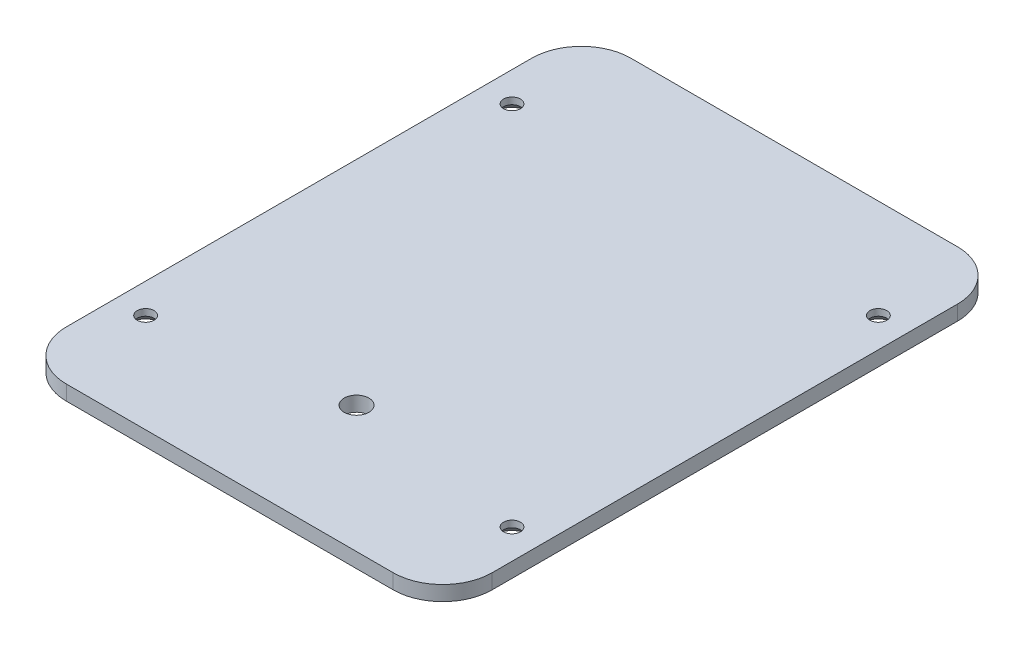
ISO-10303-21;
HEADER;
FILE_DESCRIPTION(('STEP AP214'),'2;1');
FILE_NAME('part.step','',(''),(''),'','','');
FILE_SCHEMA(('AUTOMOTIVE_DESIGN { 1 0 10303 214 1 1 1 1 }'));
ENDSEC;
DATA;
#1=APPLICATION_CONTEXT('core data for automotive mechanical design processes');
#2=APPLICATION_PROTOCOL_DEFINITION('international standard','automotive_design',2000,#1);
#3=PRODUCT_CONTEXT('',#1,'mechanical');
#4=PRODUCT('Part','Part','',(#3));
#5=PRODUCT_RELATED_PRODUCT_CATEGORY('part','',(#4));
#6=PRODUCT_DEFINITION_FORMATION('','',#4);
#7=PRODUCT_DEFINITION_CONTEXT('part definition',#1,'design');
#8=PRODUCT_DEFINITION('design','',#6,#7);
#9=PRODUCT_DEFINITION_SHAPE('','',#8);
#10=(LENGTH_UNIT() NAMED_UNIT(*) SI_UNIT(.MILLI.,.METRE.));
#11=(NAMED_UNIT(*) PLANE_ANGLE_UNIT() SI_UNIT($,.RADIAN.));
#12=(NAMED_UNIT(*) SI_UNIT($,.STERADIAN.) SOLID_ANGLE_UNIT());
#13=UNCERTAINTY_MEASURE_WITH_UNIT(LENGTH_MEASURE(1.E-05),#10,'distance_accuracy_value','');
#14=(GEOMETRIC_REPRESENTATION_CONTEXT(3) GLOBAL_UNCERTAINTY_ASSIGNED_CONTEXT((#13)) GLOBAL_UNIT_ASSIGNED_CONTEXT((#10,
#11,#12)) REPRESENTATION_CONTEXT('',''));
#15=CARTESIAN_POINT('',(0.,0.,0.));
#16=DIRECTION('',(0.,0.,1.));
#17=DIRECTION('',(1.,0.,0.));
#18=AXIS2_PLACEMENT_3D('',#15,#16,#17);
#19=CARTESIAN_POINT('',(-33.,3.,47.));
#20=DIRECTION('',(0.,-1.,0.));
#21=DIRECTION('',(0.,0.,-1.));
#22=AXIS2_PLACEMENT_3D('',#19,#20,#21);
#23=CYLINDRICAL_SURFACE('',#22,10.);
#24=CARTESIAN_POINT('',(-33.,0.,47.));
#25=DIRECTION('',(0.,1.,0.));
#26=DIRECTION('',(0.,0.,1.));
#27=AXIS2_PLACEMENT_3D('',#24,#25,#26);
#28=CIRCLE('',#27,10.);
#29=CARTESIAN_POINT('',(-43.,0.,47.));
#30=VERTEX_POINT('',#29);
#31=CARTESIAN_POINT('',(-33.,0.,57.));
#32=VERTEX_POINT('',#31);
#33=EDGE_CURVE('E131',#30,#32,#28,.T.);
#34=ORIENTED_EDGE('',*,*,#33,.T.);
#35=DIRECTION('',(0.,-1.,0.));
#36=VECTOR('',#35,1.);
#37=CARTESIAN_POINT('',(-33.,3.,57.));
#38=LINE('',#37,#36);
#39=CARTESIAN_POINT('',(-33.,3.,57.));
#40=VERTEX_POINT('',#39);
#41=EDGE_CURVE('E11',#40,#32,#38,.T.);
#42=ORIENTED_EDGE('',*,*,#41,.F.);
#43=CARTESIAN_POINT('',(-33.,3.,47.));
#44=DIRECTION('',(0.,1.,0.));
#45=DIRECTION('',(0.,0.,1.));
#46=AXIS2_PLACEMENT_3D('',#43,#44,#45);
#47=CIRCLE('',#46,10.);
#48=CARTESIAN_POINT('',(-43.,3.,47.));
#49=VERTEX_POINT('',#48);
#50=EDGE_CURVE('E146',#49,#40,#47,.T.);
#51=ORIENTED_EDGE('',*,*,#50,.F.);
#52=DIRECTION('',(0.,-1.,0.));
#53=VECTOR('',#52,1.);
#54=CARTESIAN_POINT('',(-43.,3.,47.));
#55=LINE('',#54,#53);
#56=EDGE_CURVE('E127',#49,#30,#55,.T.);
#57=ORIENTED_EDGE('',*,*,#56,.T.);
#58=EDGE_LOOP('',(#34,#42,#51,#57));
#59=FACE_BOUND('',#58,.T.);
#60=ADVANCED_FACE('F33',(#59),#23,.T.);
#61=CARTESIAN_POINT('',(33.,3.,57.));
#62=DIRECTION('',(0.,0.,-1.));
#63=DIRECTION('',(-1.,0.,0.));
#64=AXIS2_PLACEMENT_3D('',#61,#62,#63);
#65=PLANE('',#64);
#66=DIRECTION('',(1.,0.,0.));
#67=VECTOR('',#66,1.);
#68=CARTESIAN_POINT('',(33.,0.,57.));
#69=LINE('',#68,#67);
#70=CARTESIAN_POINT('',(33.,0.,57.));
#71=VERTEX_POINT('',#70);
#72=EDGE_CURVE('E134',#32,#71,#69,.T.);
#73=ORIENTED_EDGE('',*,*,#72,.T.);
#74=DIRECTION('',(0.,-1.,0.));
#75=VECTOR('',#74,1.);
#76=CARTESIAN_POINT('',(33.,3.,57.));
#77=LINE('',#76,#75);
#78=CARTESIAN_POINT('',(33.,3.,57.));
#79=VERTEX_POINT('',#78);
#80=EDGE_CURVE('E42',#79,#71,#77,.T.);
#81=ORIENTED_EDGE('',*,*,#80,.F.);
#82=DIRECTION('',(1.,0.,0.));
#83=VECTOR('',#82,1.);
#84=CARTESIAN_POINT('',(33.,3.,57.));
#85=LINE('',#84,#83);
#86=EDGE_CURVE('E94',#40,#79,#85,.T.);
#87=ORIENTED_EDGE('',*,*,#86,.F.);
#88=ORIENTED_EDGE('',*,*,#41,.T.);
#89=EDGE_LOOP('',(#73,#81,#87,#88));
#90=FACE_BOUND('',#89,.T.);
#91=ADVANCED_FACE('F228',(#90),#65,.F.);
#92=CARTESIAN_POINT('',(33.,3.,47.));
#93=DIRECTION('',(0.,-1.,0.));
#94=DIRECTION('',(0.,0.,-1.));
#95=AXIS2_PLACEMENT_3D('',#92,#93,#94);
#96=CYLINDRICAL_SURFACE('',#95,10.);
#97=CARTESIAN_POINT('',(33.,0.,47.));
#98=DIRECTION('',(0.,1.,0.));
#99=DIRECTION('',(0.,0.,1.));
#100=AXIS2_PLACEMENT_3D('',#97,#98,#99);
#101=CIRCLE('',#100,10.);
#102=CARTESIAN_POINT('',(43.,0.,47.));
#103=VERTEX_POINT('',#102);
#104=EDGE_CURVE('E137',#71,#103,#101,.T.);
#105=ORIENTED_EDGE('',*,*,#104,.T.);
#106=DIRECTION('',(0.,-1.,0.));
#107=VECTOR('',#106,1.);
#108=CARTESIAN_POINT('',(43.,3.,47.));
#109=LINE('',#108,#107);
#110=CARTESIAN_POINT('',(43.,3.,47.));
#111=VERTEX_POINT('',#110);
#112=EDGE_CURVE('E153',#111,#103,#109,.T.);
#113=ORIENTED_EDGE('',*,*,#112,.F.);
#114=CARTESIAN_POINT('',(33.,3.,47.));
#115=DIRECTION('',(0.,1.,0.));
#116=DIRECTION('',(0.,0.,1.));
#117=AXIS2_PLACEMENT_3D('',#114,#115,#116);
#118=CIRCLE('',#117,10.);
#119=EDGE_CURVE('E196',#79,#111,#118,.T.);
#120=ORIENTED_EDGE('',*,*,#119,.F.);
#121=ORIENTED_EDGE('',*,*,#80,.T.);
#122=EDGE_LOOP('',(#105,#113,#120,#121));
#123=FACE_BOUND('',#122,.T.);
#124=ADVANCED_FACE('F232',(#123),#96,.T.);
#125=CARTESIAN_POINT('',(43.,3.,-47.));
#126=DIRECTION('',(-1.,0.,0.));
#127=DIRECTION('',(0.,0.,1.));
#128=AXIS2_PLACEMENT_3D('',#125,#126,#127);
#129=PLANE('',#128);
#130=DIRECTION('',(0.,0.,-1.));
#131=VECTOR('',#130,1.);
#132=CARTESIAN_POINT('',(43.,0.,-47.));
#133=LINE('',#132,#131);
#134=CARTESIAN_POINT('',(43.,0.,-47.));
#135=VERTEX_POINT('',#134);
#136=EDGE_CURVE('E139',#103,#135,#133,.T.);
#137=ORIENTED_EDGE('',*,*,#136,.T.);
#138=DIRECTION('',(0.,-1.,0.));
#139=VECTOR('',#138,1.);
#140=CARTESIAN_POINT('',(43.,3.,-47.));
#141=LINE('',#140,#139);
#142=CARTESIAN_POINT('',(43.,3.,-47.));
#143=VERTEX_POINT('',#142);
#144=EDGE_CURVE('E150',#143,#135,#141,.T.);
#145=ORIENTED_EDGE('',*,*,#144,.F.);
#146=DIRECTION('',(0.,0.,-1.));
#147=VECTOR('',#146,1.);
#148=CARTESIAN_POINT('',(43.,3.,-47.));
#149=LINE('',#148,#147);
#150=EDGE_CURVE('E198',#111,#143,#149,.T.);
#151=ORIENTED_EDGE('',*,*,#150,.F.);
#152=ORIENTED_EDGE('',*,*,#112,.T.);
#153=EDGE_LOOP('',(#137,#145,#151,#152));
#154=FACE_BOUND('',#153,.T.);
#155=ADVANCED_FACE('F204',(#154),#129,.F.);
#156=CARTESIAN_POINT('',(33.,3.,-47.));
#157=DIRECTION('',(0.,-1.,0.));
#158=DIRECTION('',(0.,0.,-1.));
#159=AXIS2_PLACEMENT_3D('',#156,#157,#158);
#160=CYLINDRICAL_SURFACE('',#159,10.);
#161=CARTESIAN_POINT('',(33.,0.,-47.));
#162=DIRECTION('',(0.,1.,0.));
#163=DIRECTION('',(0.,0.,1.));
#164=AXIS2_PLACEMENT_3D('',#161,#162,#163);
#165=CIRCLE('',#164,10.);
#166=CARTESIAN_POINT('',(33.,0.,-57.));
#167=VERTEX_POINT('',#166);
#168=EDGE_CURVE('E141',#135,#167,#165,.T.);
#169=ORIENTED_EDGE('',*,*,#168,.T.);
#170=DIRECTION('',(0.,-1.,0.));
#171=VECTOR('',#170,1.);
#172=CARTESIAN_POINT('',(33.,3.,-57.));
#173=LINE('',#172,#171);
#174=CARTESIAN_POINT('',(33.,3.,-57.));
#175=VERTEX_POINT('',#174);
#176=EDGE_CURVE('E122',#175,#167,#173,.T.);
#177=ORIENTED_EDGE('',*,*,#176,.F.);
#178=CARTESIAN_POINT('',(33.,3.,-47.));
#179=DIRECTION('',(0.,1.,0.));
#180=DIRECTION('',(0.,0.,1.));
#181=AXIS2_PLACEMENT_3D('',#178,#179,#180);
#182=CIRCLE('',#181,10.);
#183=EDGE_CURVE('E113',#143,#175,#182,.T.);
#184=ORIENTED_EDGE('',*,*,#183,.F.);
#185=ORIENTED_EDGE('',*,*,#144,.T.);
#186=EDGE_LOOP('',(#169,#177,#184,#185));
#187=FACE_BOUND('',#186,.T.);
#188=ADVANCED_FACE('F208',(#187),#160,.T.);
#189=CARTESIAN_POINT('',(-33.,3.,-57.));
#190=DIRECTION('',(0.,0.,1.));
#191=DIRECTION('',(1.,0.,0.));
#192=AXIS2_PLACEMENT_3D('',#189,#190,#191);
#193=PLANE('',#192);
#194=DIRECTION('',(-1.,0.,0.));
#195=VECTOR('',#194,1.);
#196=CARTESIAN_POINT('',(-33.,0.,-57.));
#197=LINE('',#196,#195);
#198=CARTESIAN_POINT('',(-33.,0.,-57.));
#199=VERTEX_POINT('',#198);
#200=EDGE_CURVE('E121',#167,#199,#197,.T.);
#201=ORIENTED_EDGE('',*,*,#200,.T.);
#202=DIRECTION('',(0.,-1.,0.));
#203=VECTOR('',#202,1.);
#204=CARTESIAN_POINT('',(-33.,3.,-57.));
#205=LINE('',#204,#203);
#206=CARTESIAN_POINT('',(-33.,3.,-57.));
#207=VERTEX_POINT('',#206);
#208=EDGE_CURVE('E118',#207,#199,#205,.T.);
#209=ORIENTED_EDGE('',*,*,#208,.F.);
#210=DIRECTION('',(-1.,0.,0.));
#211=VECTOR('',#210,1.);
#212=CARTESIAN_POINT('',(-33.,3.,-57.));
#213=LINE('',#212,#211);
#214=EDGE_CURVE('E107',#175,#207,#213,.T.);
#215=ORIENTED_EDGE('',*,*,#214,.F.);
#216=ORIENTED_EDGE('',*,*,#176,.T.);
#217=EDGE_LOOP('',(#201,#209,#215,#216));
#218=FACE_BOUND('',#217,.T.);
#219=ADVANCED_FACE('F119',(#218),#193,.F.);
#220=CARTESIAN_POINT('',(-33.,3.,-47.));
#221=DIRECTION('',(0.,-1.,0.));
#222=DIRECTION('',(0.,0.,-1.));
#223=AXIS2_PLACEMENT_3D('',#220,#221,#222);
#224=CYLINDRICAL_SURFACE('',#223,10.);
#225=CARTESIAN_POINT('',(-33.,0.,-47.));
#226=DIRECTION('',(0.,1.,0.));
#227=DIRECTION('',(0.,0.,1.));
#228=AXIS2_PLACEMENT_3D('',#225,#226,#227);
#229=CIRCLE('',#228,10.);
#230=CARTESIAN_POINT('',(-43.,0.,-47.));
#231=VERTEX_POINT('',#230);
#232=EDGE_CURVE('E80',#199,#231,#229,.T.);
#233=ORIENTED_EDGE('',*,*,#232,.T.);
#234=DIRECTION('',(0.,-1.,0.));
#235=VECTOR('',#234,1.);
#236=CARTESIAN_POINT('',(-43.,3.,-47.));
#237=LINE('',#236,#235);
#238=CARTESIAN_POINT('',(-43.,3.,-47.));
#239=VERTEX_POINT('',#238);
#240=EDGE_CURVE('E123',#239,#231,#237,.T.);
#241=ORIENTED_EDGE('',*,*,#240,.F.);
#242=CARTESIAN_POINT('',(-33.,3.,-47.));
#243=DIRECTION('',(0.,1.,0.));
#244=DIRECTION('',(0.,0.,1.));
#245=AXIS2_PLACEMENT_3D('',#242,#243,#244);
#246=CIRCLE('',#245,10.);
#247=EDGE_CURVE('E111',#207,#239,#246,.T.);
#248=ORIENTED_EDGE('',*,*,#247,.F.);
#249=ORIENTED_EDGE('',*,*,#208,.T.);
#250=EDGE_LOOP('',(#233,#241,#248,#249));
#251=FACE_BOUND('',#250,.T.);
#252=ADVANCED_FACE('F125',(#251),#224,.T.);
#253=CARTESIAN_POINT('',(-43.,3.,47.));
#254=DIRECTION('',(1.,0.,0.));
#255=DIRECTION('',(0.,0.,-1.));
#256=AXIS2_PLACEMENT_3D('',#253,#254,#255);
#257=PLANE('',#256);
#258=DIRECTION('',(0.,0.,1.));
#259=VECTOR('',#258,1.);
#260=CARTESIAN_POINT('',(-43.,0.,47.));
#261=LINE('',#260,#259);
#262=EDGE_CURVE('E86',#231,#30,#261,.T.);
#263=ORIENTED_EDGE('',*,*,#262,.T.);
#264=ORIENTED_EDGE('',*,*,#56,.F.);
#265=DIRECTION('',(0.,0.,1.));
#266=VECTOR('',#265,1.);
#267=CARTESIAN_POINT('',(-43.,3.,47.));
#268=LINE('',#267,#266);
#269=EDGE_CURVE('E51',#239,#49,#268,.T.);
#270=ORIENTED_EDGE('',*,*,#269,.F.);
#271=ORIENTED_EDGE('',*,*,#240,.T.);
#272=EDGE_LOOP('',(#263,#264,#270,#271));
#273=FACE_BOUND('',#272,.T.);
#274=ADVANCED_FACE('F216',(#273),#257,.F.);
#275=CARTESIAN_POINT('',(-33.,3.,47.));
#276=DIRECTION('',(0.,1.,0.));
#277=DIRECTION('',(0.,0.,1.));
#278=AXIS2_PLACEMENT_3D('',#275,#276,#277);
#279=PLANE('',#278);
#280=CARTESIAN_POINT('',(-37.,3.,-37.));
#281=DIRECTION('',(0.,1.,0.));
#282=DIRECTION('',(0.,0.,1.));
#283=AXIS2_PLACEMENT_3D('',#280,#281,#282);
#284=CIRCLE('',#283,1.69999999999999);
#285=CARTESIAN_POINT('',(-37.,3.,-35.3));
#286=VERTEX_POINT('',#285);
#287=EDGE_CURVE('E36',#286,#286,#284,.T.);
#288=ORIENTED_EDGE('',*,*,#287,.F.);
#289=EDGE_LOOP('',(#288));
#290=FACE_BOUND('',#289,.T.);
#291=CARTESIAN_POINT('',(-37.,3.,37.));
#292=DIRECTION('',(0.,1.,0.));
#293=DIRECTION('',(0.,0.,1.));
#294=AXIS2_PLACEMENT_3D('',#291,#292,#293);
#295=CIRCLE('',#294,1.69999999999999);
#296=CARTESIAN_POINT('',(-37.,3.,38.7));
#297=VERTEX_POINT('',#296);
#298=EDGE_CURVE('E167',#297,#297,#295,.T.);
#299=ORIENTED_EDGE('',*,*,#298,.F.);
#300=EDGE_LOOP('',(#299));
#301=FACE_BOUND('',#300,.T.);
#302=CARTESIAN_POINT('',(37.,3.,-37.));
#303=DIRECTION('',(0.,1.,0.));
#304=DIRECTION('',(0.,0.,1.));
#305=AXIS2_PLACEMENT_3D('',#302,#303,#304);
#306=CIRCLE('',#305,1.69999999999999);
#307=CARTESIAN_POINT('',(37.,3.,-35.3));
#308=VERTEX_POINT('',#307);
#309=EDGE_CURVE('E163',#308,#308,#306,.T.);
#310=ORIENTED_EDGE('',*,*,#309,.F.);
#311=EDGE_LOOP('',(#310));
#312=FACE_BOUND('',#311,.T.);
#313=CARTESIAN_POINT('',(37.,3.,37.));
#314=DIRECTION('',(0.,1.,0.));
#315=DIRECTION('',(0.,0.,1.));
#316=AXIS2_PLACEMENT_3D('',#313,#314,#315);
#317=CIRCLE('',#316,1.69999999999999);
#318=CARTESIAN_POINT('',(37.,3.,38.7));
#319=VERTEX_POINT('',#318);
#320=EDGE_CURVE('E158',#319,#319,#317,.T.);
#321=ORIENTED_EDGE('',*,*,#320,.F.);
#322=EDGE_LOOP('',(#321));
#323=FACE_BOUND('',#322,.T.);
#324=CARTESIAN_POINT('',(0.,3.,31.4));
#325=DIRECTION('',(0.,-1.,0.));
#326=DIRECTION('',(0.,0.,-1.));
#327=AXIS2_PLACEMENT_3D('',#324,#325,#326);
#328=CIRCLE('',#327,2.5);
#329=CARTESIAN_POINT('',(0.,3.,28.9));
#330=VERTEX_POINT('',#329);
#331=EDGE_CURVE('E135',#330,#330,#328,.T.);
#332=ORIENTED_EDGE('',*,*,#331,.T.);
#333=EDGE_LOOP('',(#332));
#334=FACE_BOUND('',#333,.T.);
#335=ORIENTED_EDGE('',*,*,#50,.T.);
#336=ORIENTED_EDGE('',*,*,#86,.T.);
#337=ORIENTED_EDGE('',*,*,#119,.T.);
#338=ORIENTED_EDGE('',*,*,#150,.T.);
#339=ORIENTED_EDGE('',*,*,#183,.T.);
#340=ORIENTED_EDGE('',*,*,#214,.T.);
#341=ORIENTED_EDGE('',*,*,#247,.T.);
#342=ORIENTED_EDGE('',*,*,#269,.T.);
#343=EDGE_LOOP('',(#335,#336,#337,#338,#339,#340,#341,#342));
#344=FACE_BOUND('',#343,.T.);
#345=ADVANCED_FACE('F109',(#290,#301,#312,#323,#334,#344),#279,.T.);
#346=CARTESIAN_POINT('',(-33.,0.,47.));
#347=DIRECTION('',(0.,1.,0.));
#348=DIRECTION('',(0.,0.,1.));
#349=AXIS2_PLACEMENT_3D('',#346,#347,#348);
#350=PLANE('',#349);
#351=CARTESIAN_POINT('',(-37.,0.,-37.));
#352=DIRECTION('',(0.,-1.,0.));
#353=DIRECTION('',(0.,0.,-1.));
#354=AXIS2_PLACEMENT_3D('',#351,#352,#353);
#355=CIRCLE('',#354,3.36);
#356=CARTESIAN_POINT('',(-37.,0.,-40.36));
#357=VERTEX_POINT('',#356);
#358=EDGE_CURVE('E369',#357,#357,#355,.T.);
#359=ORIENTED_EDGE('',*,*,#358,.F.);
#360=EDGE_LOOP('',(#359));
#361=FACE_BOUND('',#360,.T.);
#362=CARTESIAN_POINT('',(-37.,0.,37.));
#363=DIRECTION('',(0.,-1.,0.));
#364=DIRECTION('',(0.,0.,-1.));
#365=AXIS2_PLACEMENT_3D('',#362,#363,#364);
#366=CIRCLE('',#365,3.36);
#367=CARTESIAN_POINT('',(-37.,0.,33.64));
#368=VERTEX_POINT('',#367);
#369=EDGE_CURVE('E176',#368,#368,#366,.T.);
#370=ORIENTED_EDGE('',*,*,#369,.F.);
#371=EDGE_LOOP('',(#370));
#372=FACE_BOUND('',#371,.T.);
#373=CARTESIAN_POINT('',(37.,0.,-37.));
#374=DIRECTION('',(0.,-1.,0.));
#375=DIRECTION('',(0.,0.,-1.));
#376=AXIS2_PLACEMENT_3D('',#373,#374,#375);
#377=CIRCLE('',#376,3.36);
#378=CARTESIAN_POINT('',(37.,0.,-40.36));
#379=VERTEX_POINT('',#378);
#380=EDGE_CURVE('E169',#379,#379,#377,.T.);
#381=ORIENTED_EDGE('',*,*,#380,.F.);
#382=EDGE_LOOP('',(#381));
#383=FACE_BOUND('',#382,.T.);
#384=CARTESIAN_POINT('',(37.,0.,37.));
#385=DIRECTION('',(0.,-1.,0.));
#386=DIRECTION('',(0.,0.,-1.));
#387=AXIS2_PLACEMENT_3D('',#384,#385,#386);
#388=CIRCLE('',#387,3.36);
#389=CARTESIAN_POINT('',(37.,0.,33.64));
#390=VERTEX_POINT('',#389);
#391=EDGE_CURVE('E165',#390,#390,#388,.T.);
#392=ORIENTED_EDGE('',*,*,#391,.F.);
#393=EDGE_LOOP('',(#392));
#394=FACE_BOUND('',#393,.T.);
#395=CARTESIAN_POINT('',(0.,0.,31.4));
#396=DIRECTION('',(0.,-1.,0.));
#397=DIRECTION('',(0.,0.,-1.));
#398=AXIS2_PLACEMENT_3D('',#395,#396,#397);
#399=CIRCLE('',#398,2.5);
#400=CARTESIAN_POINT('',(0.,0.,28.9));
#401=VERTEX_POINT('',#400);
#402=EDGE_CURVE('E161',#401,#401,#399,.T.);
#403=ORIENTED_EDGE('',*,*,#402,.F.);
#404=EDGE_LOOP('',(#403));
#405=FACE_BOUND('',#404,.T.);
#406=ORIENTED_EDGE('',*,*,#33,.F.);
#407=ORIENTED_EDGE('',*,*,#262,.F.);
#408=ORIENTED_EDGE('',*,*,#232,.F.);
#409=ORIENTED_EDGE('',*,*,#200,.F.);
#410=ORIENTED_EDGE('',*,*,#168,.F.);
#411=ORIENTED_EDGE('',*,*,#136,.F.);
#412=ORIENTED_EDGE('',*,*,#104,.F.);
#413=ORIENTED_EDGE('',*,*,#72,.F.);
#414=EDGE_LOOP('',(#406,#407,#408,#409,#410,#411,#412,#413));
#415=FACE_BOUND('',#414,.T.);
#416=ADVANCED_FACE('F211',(#361,#372,#383,#394,#405,#415),#350,.F.);
#417=CARTESIAN_POINT('',(0.,3.,31.4));
#418=DIRECTION('',(0.,-1.,0.));
#419=DIRECTION('',(0.,0.,-1.));
#420=AXIS2_PLACEMENT_3D('',#417,#418,#419);
#421=CYLINDRICAL_SURFACE('',#420,2.5);
#422=ORIENTED_EDGE('',*,*,#331,.F.);
#423=EDGE_LOOP('',(#422));
#424=FACE_BOUND('',#423,.T.);
#425=ORIENTED_EDGE('',*,*,#402,.T.);
#426=EDGE_LOOP('',(#425));
#427=FACE_BOUND('',#426,.T.);
#428=ADVANCED_FACE('F262',(#424,#427),#421,.F.);
#429=CARTESIAN_POINT('',(37.,0.,37.));
#430=DIRECTION('',(0.,-1.,0.));
#431=DIRECTION('',(0.,0.,-1.));
#432=AXIS2_PLACEMENT_3D('',#429,#430,#431);
#433=CYLINDRICAL_SURFACE('',#432,1.69999999999999);
#434=ORIENTED_EDGE('',*,*,#320,.T.);
#435=EDGE_LOOP('',(#434));
#436=FACE_BOUND('',#435,.T.);
#437=CARTESIAN_POINT('',(37.,1.66000000000001,37.));
#438=DIRECTION('',(0.,-1.,0.));
#439=DIRECTION('',(0.,0.,-1.));
#440=AXIS2_PLACEMENT_3D('',#437,#438,#439);
#441=CIRCLE('',#440,1.69999999999999);
#442=CARTESIAN_POINT('',(37.,1.66000000000001,35.3));
#443=VERTEX_POINT('',#442);
#444=EDGE_CURVE('E162',#443,#443,#441,.T.);
#445=ORIENTED_EDGE('',*,*,#444,.T.);
#446=EDGE_LOOP('',(#445));
#447=FACE_BOUND('',#446,.T.);
#448=ADVANCED_FACE('F267',(#436,#447),#433,.F.);
#449=CARTESIAN_POINT('',(37.,0.,37.));
#450=DIRECTION('',(0.,-1.,0.));
#451=DIRECTION('',(0.,0.,-1.));
#452=AXIS2_PLACEMENT_3D('',#449,#450,#451);
#453=CONICAL_SURFACE('',#452,3.36,0.785398163397448);
#454=ORIENTED_EDGE('',*,*,#444,.F.);
#455=EDGE_LOOP('',(#454));
#456=FACE_BOUND('',#455,.T.);
#457=ORIENTED_EDGE('',*,*,#391,.T.);
#458=EDGE_LOOP('',(#457));
#459=FACE_BOUND('',#458,.T.);
#460=ADVANCED_FACE('F290',(#456,#459),#453,.F.);
#461=CARTESIAN_POINT('',(37.,0.,-37.));
#462=DIRECTION('',(0.,-1.,0.));
#463=DIRECTION('',(0.,0.,-1.));
#464=AXIS2_PLACEMENT_3D('',#461,#462,#463);
#465=CYLINDRICAL_SURFACE('',#464,1.69999999999999);
#466=ORIENTED_EDGE('',*,*,#309,.T.);
#467=EDGE_LOOP('',(#466));
#468=FACE_BOUND('',#467,.T.);
#469=CARTESIAN_POINT('',(37.,1.66000000000001,-37.));
#470=DIRECTION('',(0.,-1.,0.));
#471=DIRECTION('',(0.,0.,-1.));
#472=AXIS2_PLACEMENT_3D('',#469,#470,#471);
#473=CIRCLE('',#472,1.69999999999999);
#474=CARTESIAN_POINT('',(37.,1.66000000000001,-38.7));
#475=VERTEX_POINT('',#474);
#476=EDGE_CURVE('E166',#475,#475,#473,.T.);
#477=ORIENTED_EDGE('',*,*,#476,.T.);
#478=EDGE_LOOP('',(#477));
#479=FACE_BOUND('',#478,.T.);
#480=ADVANCED_FACE('F300',(#468,#479),#465,.F.);
#481=CARTESIAN_POINT('',(37.,0.,-37.));
#482=DIRECTION('',(0.,-1.,0.));
#483=DIRECTION('',(0.,0.,-1.));
#484=AXIS2_PLACEMENT_3D('',#481,#482,#483);
#485=CONICAL_SURFACE('',#484,3.36,0.785398163397448);
#486=ORIENTED_EDGE('',*,*,#476,.F.);
#487=EDGE_LOOP('',(#486));
#488=FACE_BOUND('',#487,.T.);
#489=ORIENTED_EDGE('',*,*,#380,.T.);
#490=EDGE_LOOP('',(#489));
#491=FACE_BOUND('',#490,.T.);
#492=ADVANCED_FACE('F310',(#488,#491),#485,.F.);
#493=CARTESIAN_POINT('',(-37.,0.,37.));
#494=DIRECTION('',(0.,-1.,0.));
#495=DIRECTION('',(0.,0.,-1.));
#496=AXIS2_PLACEMENT_3D('',#493,#494,#495);
#497=CYLINDRICAL_SURFACE('',#496,1.69999999999999);
#498=ORIENTED_EDGE('',*,*,#298,.T.);
#499=EDGE_LOOP('',(#498));
#500=FACE_BOUND('',#499,.T.);
#501=CARTESIAN_POINT('',(-37.,1.66000000000001,37.));
#502=DIRECTION('',(0.,-1.,0.));
#503=DIRECTION('',(0.,0.,-1.));
#504=AXIS2_PLACEMENT_3D('',#501,#502,#503);
#505=CIRCLE('',#504,1.69999999999999);
#506=CARTESIAN_POINT('',(-37.,1.66000000000001,35.3));
#507=VERTEX_POINT('',#506);
#508=EDGE_CURVE('E170',#507,#507,#505,.T.);
#509=ORIENTED_EDGE('',*,*,#508,.T.);
#510=EDGE_LOOP('',(#509));
#511=FACE_BOUND('',#510,.T.);
#512=ADVANCED_FACE('F320',(#500,#511),#497,.F.);
#513=CARTESIAN_POINT('',(-37.,0.,37.));
#514=DIRECTION('',(0.,-1.,0.));
#515=DIRECTION('',(0.,0.,-1.));
#516=AXIS2_PLACEMENT_3D('',#513,#514,#515);
#517=CONICAL_SURFACE('',#516,3.36,0.785398163397448);
#518=ORIENTED_EDGE('',*,*,#508,.F.);
#519=EDGE_LOOP('',(#518));
#520=FACE_BOUND('',#519,.T.);
#521=ORIENTED_EDGE('',*,*,#369,.T.);
#522=EDGE_LOOP('',(#521));
#523=FACE_BOUND('',#522,.T.);
#524=ADVANCED_FACE('F330',(#520,#523),#517,.F.);
#525=CARTESIAN_POINT('',(-37.,0.,-37.));
#526=DIRECTION('',(0.,-1.,0.));
#527=DIRECTION('',(0.,0.,-1.));
#528=AXIS2_PLACEMENT_3D('',#525,#526,#527);
#529=CYLINDRICAL_SURFACE('',#528,1.69999999999999);
#530=ORIENTED_EDGE('',*,*,#287,.T.);
#531=EDGE_LOOP('',(#530));
#532=FACE_BOUND('',#531,.T.);
#533=CARTESIAN_POINT('',(-37.,1.66000000000001,-37.));
#534=DIRECTION('',(0.,-1.,0.));
#535=DIRECTION('',(0.,0.,-1.));
#536=AXIS2_PLACEMENT_3D('',#533,#534,#535);
#537=CIRCLE('',#536,1.69999999999999);
#538=CARTESIAN_POINT('',(-37.,1.66000000000001,-38.7));
#539=VERTEX_POINT('',#538);
#540=EDGE_CURVE('E366',#539,#539,#537,.T.);
#541=ORIENTED_EDGE('',*,*,#540,.T.);
#542=EDGE_LOOP('',(#541));
#543=FACE_BOUND('',#542,.T.);
#544=ADVANCED_FACE('F339',(#532,#543),#529,.F.);
#545=CARTESIAN_POINT('',(-37.,0.,-37.));
#546=DIRECTION('',(0.,-1.,0.));
#547=DIRECTION('',(0.,0.,-1.));
#548=AXIS2_PLACEMENT_3D('',#545,#546,#547);
#549=CONICAL_SURFACE('',#548,3.36,0.785398163397448);
#550=ORIENTED_EDGE('',*,*,#540,.F.);
#551=EDGE_LOOP('',(#550));
#552=FACE_BOUND('',#551,.T.);
#553=ORIENTED_EDGE('',*,*,#358,.T.);
#554=EDGE_LOOP('',(#553));
#555=FACE_BOUND('',#554,.T.);
#556=ADVANCED_FACE('F349',(#552,#555),#549,.F.);
#557=CLOSED_SHELL('',(#60,#91,#124,#155,#188,#219,#252,#274,#345,#416,#428,#448,#460,#480,#492,
#512,#524,#544,#556));
#558=MANIFOLD_SOLID_BREP('B2',#557);
#559=ADVANCED_BREP_SHAPE_REPRESENTATION('',(#18,#558),#14);
#560=SHAPE_DEFINITION_REPRESENTATION(#9,#559);
ENDSEC;
END-ISO-10303-21;
